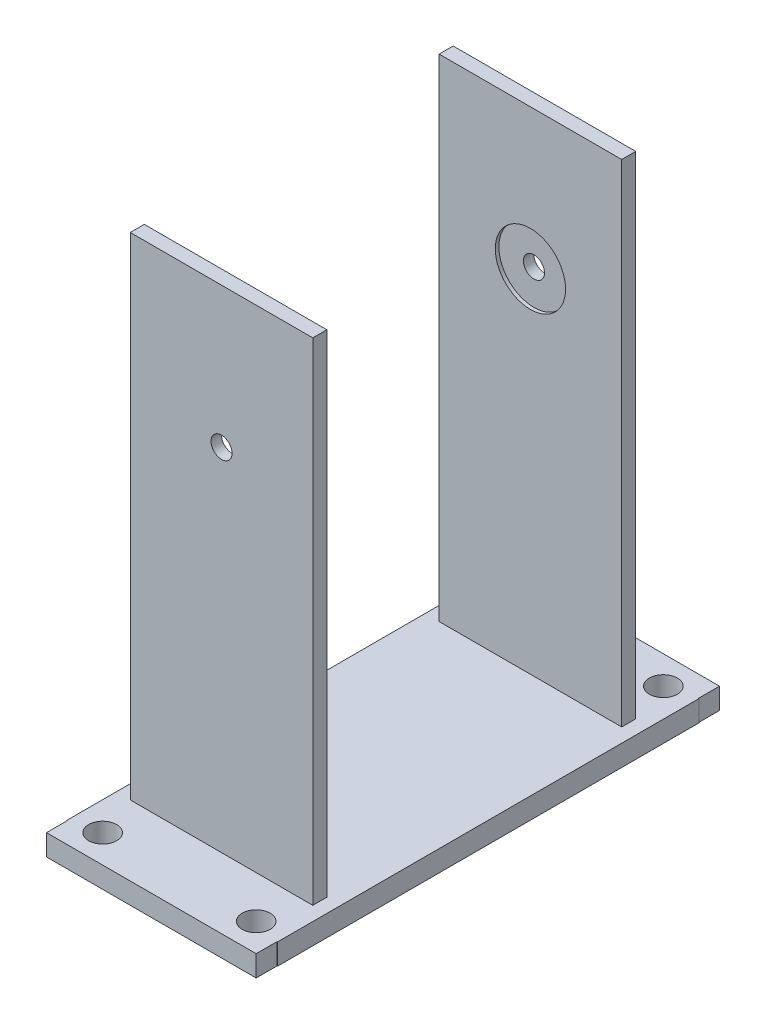
ISO-10303-21;
HEADER;
FILE_DESCRIPTION(('STEP AP214'),'2;1');
FILE_NAME('part.step','',(''),(''),'','','');
FILE_SCHEMA(('AUTOMOTIVE_DESIGN { 1 0 10303 214 1 1 1 1 }'));
ENDSEC;
DATA;
#1=APPLICATION_CONTEXT('core data for automotive mechanical design processes');
#2=APPLICATION_PROTOCOL_DEFINITION('international standard','automotive_design',2000,#1);
#3=PRODUCT_CONTEXT('',#1,'mechanical');
#4=PRODUCT('Part','Part','',(#3));
#5=PRODUCT_RELATED_PRODUCT_CATEGORY('part','',(#4));
#6=PRODUCT_DEFINITION_FORMATION('','',#4);
#7=PRODUCT_DEFINITION_CONTEXT('part definition',#1,'design');
#8=PRODUCT_DEFINITION('design','',#6,#7);
#9=PRODUCT_DEFINITION_SHAPE('','',#8);
#10=(LENGTH_UNIT() NAMED_UNIT(*) SI_UNIT(.MILLI.,.METRE.));
#11=(NAMED_UNIT(*) PLANE_ANGLE_UNIT() SI_UNIT($,.RADIAN.));
#12=(NAMED_UNIT(*) SI_UNIT($,.STERADIAN.) SOLID_ANGLE_UNIT());
#13=UNCERTAINTY_MEASURE_WITH_UNIT(LENGTH_MEASURE(1.E-05),#10,'distance_accuracy_value','');
#14=(GEOMETRIC_REPRESENTATION_CONTEXT(3) GLOBAL_UNCERTAINTY_ASSIGNED_CONTEXT((#13)) GLOBAL_UNIT_ASSIGNED_CONTEXT((#10,
#11,#12)) REPRESENTATION_CONTEXT('',''));
#15=CARTESIAN_POINT('',(0.,0.,0.));
#16=DIRECTION('',(0.,0.,1.));
#17=DIRECTION('',(1.,0.,0.));
#18=AXIS2_PLACEMENT_3D('',#15,#16,#17);
#19=CARTESIAN_POINT('',(0.,3.,0.));
#20=DIRECTION('',(0.,-1.,0.));
#21=DIRECTION('',(0.,0.,-1.));
#22=AXIS2_PLACEMENT_3D('',#19,#20,#21);
#23=PLANE('',#22);
#24=CARTESIAN_POINT('',(10.9297736953923,3.,-29.));
#25=DIRECTION('',(0.,-1.,0.));
#26=DIRECTION('',(0.,0.,-1.));
#27=AXIS2_PLACEMENT_3D('',#24,#25,#26);
#28=CIRCLE('',#27,2.);
#29=CARTESIAN_POINT('',(10.9297736953923,3.,-31.));
#30=VERTEX_POINT('',#29);
#31=EDGE_CURVE('E273',#30,#30,#28,.T.);
#32=ORIENTED_EDGE('',*,*,#31,.T.);
#33=EDGE_LOOP('',(#32));
#34=FACE_BOUND('',#33,.T.);
#35=CARTESIAN_POINT('',(-10.9297736953925,3.,29.));
#36=DIRECTION('',(0.,-1.,0.));
#37=DIRECTION('',(0.,0.,-1.));
#38=AXIS2_PLACEMENT_3D('',#35,#36,#37);
#39=CIRCLE('',#38,2.);
#40=CARTESIAN_POINT('',(-10.9297736953925,3.,27.));
#41=VERTEX_POINT('',#40);
#42=EDGE_CURVE('E269',#41,#41,#39,.T.);
#43=ORIENTED_EDGE('',*,*,#42,.T.);
#44=EDGE_LOOP('',(#43));
#45=FACE_BOUND('',#44,.T.);
#46=DIRECTION('',(1.,0.,0.));
#47=VECTOR('',#46,1.);
#48=CARTESIAN_POINT('',(0.,3.,-23.));
#49=LINE('',#48,#47);
#50=CARTESIAN_POINT('',(-13.,3.,-23.));
#51=VERTEX_POINT('',#50);
#52=CARTESIAN_POINT('',(13.,3.,-23.));
#53=VERTEX_POINT('',#52);
#54=EDGE_CURVE('E388',#51,#53,#49,.T.);
#55=ORIENTED_EDGE('',*,*,#54,.T.);
#56=DIRECTION('',(0.,0.,1.));
#57=VECTOR('',#56,1.);
#58=CARTESIAN_POINT('',(13.,3.,0.));
#59=LINE('',#58,#57);
#60=CARTESIAN_POINT('',(13.,3.,-21.));
#61=VERTEX_POINT('',#60);
#62=EDGE_CURVE('E385',#53,#61,#59,.T.);
#63=ORIENTED_EDGE('',*,*,#62,.T.);
#64=DIRECTION('',(1.,0.,0.));
#65=VECTOR('',#64,1.);
#66=CARTESIAN_POINT('',(0.,3.,-21.));
#67=LINE('',#66,#65);
#68=CARTESIAN_POINT('',(-13.,3.,-21.));
#69=VERTEX_POINT('',#68);
#70=EDGE_CURVE('E374',#69,#61,#67,.T.);
#71=ORIENTED_EDGE('',*,*,#70,.F.);
#72=DIRECTION('',(0.,0.,1.));
#73=VECTOR('',#72,1.);
#74=CARTESIAN_POINT('',(-13.,3.,0.));
#75=LINE('',#74,#73);
#76=EDGE_CURVE('E392',#51,#69,#75,.T.);
#77=ORIENTED_EDGE('',*,*,#76,.F.);
#78=EDGE_LOOP('',(#55,#63,#71,#77));
#79=FACE_BOUND('',#78,.T.);
#80=DIRECTION('',(1.,0.,0.));
#81=VECTOR('',#80,1.);
#82=CARTESIAN_POINT('',(0.,3.,23.));
#83=LINE('',#82,#81);
#84=CARTESIAN_POINT('',(-13.,3.,23.));
#85=VERTEX_POINT('',#84);
#86=CARTESIAN_POINT('',(13.,3.,23.));
#87=VERTEX_POINT('',#86);
#88=EDGE_CURVE('E432',#85,#87,#83,.T.);
#89=ORIENTED_EDGE('',*,*,#88,.F.);
#90=DIRECTION('',(0.,0.,-1.));
#91=VECTOR('',#90,1.);
#92=CARTESIAN_POINT('',(-13.,3.,0.));
#93=LINE('',#92,#91);
#94=CARTESIAN_POINT('',(-13.,3.,21.));
#95=VERTEX_POINT('',#94);
#96=EDGE_CURVE('E368',#85,#95,#93,.T.);
#97=ORIENTED_EDGE('',*,*,#96,.T.);
#98=DIRECTION('',(1.,0.,0.));
#99=VECTOR('',#98,1.);
#100=CARTESIAN_POINT('',(0.,3.,21.));
#101=LINE('',#100,#99);
#102=CARTESIAN_POINT('',(13.,3.,21.));
#103=VERTEX_POINT('',#102);
#104=EDGE_CURVE('E418',#95,#103,#101,.T.);
#105=ORIENTED_EDGE('',*,*,#104,.T.);
#106=DIRECTION('',(0.,0.,-1.));
#107=VECTOR('',#106,1.);
#108=CARTESIAN_POINT('',(13.,3.,0.));
#109=LINE('',#108,#107);
#110=EDGE_CURVE('E435',#87,#103,#109,.T.);
#111=ORIENTED_EDGE('',*,*,#110,.F.);
#112=EDGE_LOOP('',(#89,#97,#105,#111));
#113=FACE_BOUND('',#112,.T.);
#114=DIRECTION('',(0.,0.,-1.));
#115=VECTOR('',#114,1.);
#116=CARTESIAN_POINT('',(15.,3.,30.));
#117=LINE('',#116,#115);
#118=CARTESIAN_POINT('',(15.,3.,30.));
#119=VERTEX_POINT('',#118);
#120=CARTESIAN_POINT('',(15.,3.,-30.));
#121=VERTEX_POINT('',#120);
#122=EDGE_CURVE('E243',#119,#121,#117,.T.);
#123=ORIENTED_EDGE('',*,*,#122,.T.);
#124=DIRECTION('',(-1.,0.,0.));
#125=VECTOR('',#124,1.);
#126=CARTESIAN_POINT('',(-15.,3.,-30.));
#127=LINE('',#126,#125);
#128=CARTESIAN_POINT('',(14.9297736953925,3.,-30.));
#129=VERTEX_POINT('',#128);
#130=EDGE_CURVE('E221',#121,#129,#127,.T.);
#131=ORIENTED_EDGE('',*,*,#130,.T.);
#132=DIRECTION('',(0.,0.,1.));
#133=VECTOR('',#132,1.);
#134=CARTESIAN_POINT('',(14.9297736953925,3.,0.));
#135=LINE('',#134,#133);
#136=CARTESIAN_POINT('',(14.9297736953925,3.,-33.));
#137=VERTEX_POINT('',#136);
#138=EDGE_CURVE('E321',#137,#129,#135,.T.);
#139=ORIENTED_EDGE('',*,*,#138,.F.);
#140=DIRECTION('',(1.,0.,0.));
#141=VECTOR('',#140,1.);
#142=CARTESIAN_POINT('',(0.,3.,-33.));
#143=LINE('',#142,#141);
#144=CARTESIAN_POINT('',(-14.9297736953925,3.,-33.));
#145=VERTEX_POINT('',#144);
#146=EDGE_CURVE('E317',#145,#137,#143,.T.);
#147=ORIENTED_EDGE('',*,*,#146,.F.);
#148=DIRECTION('',(0.,0.,1.));
#149=VECTOR('',#148,1.);
#150=CARTESIAN_POINT('',(-14.9297736953925,3.,0.));
#151=LINE('',#150,#149);
#152=CARTESIAN_POINT('',(-14.9297736953925,3.,-30.));
#153=VERTEX_POINT('',#152);
#154=EDGE_CURVE('E324',#145,#153,#151,.T.);
#155=ORIENTED_EDGE('',*,*,#154,.T.);
#156=CARTESIAN_POINT('',(-15.,3.,-30.));
#157=VERTEX_POINT('',#156);
#158=EDGE_CURVE('E454',#153,#157,#127,.T.);
#159=ORIENTED_EDGE('',*,*,#158,.T.);
#160=DIRECTION('',(0.,0.,1.));
#161=VECTOR('',#160,1.);
#162=CARTESIAN_POINT('',(-15.,3.,30.));
#163=LINE('',#162,#161);
#164=CARTESIAN_POINT('',(-15.,3.,30.));
#165=VERTEX_POINT('',#164);
#166=EDGE_CURVE('E216',#157,#165,#163,.T.);
#167=ORIENTED_EDGE('',*,*,#166,.T.);
#168=DIRECTION('',(1.,0.,0.));
#169=VECTOR('',#168,1.);
#170=CARTESIAN_POINT('',(-15.,3.,30.));
#171=LINE('',#170,#169);
#172=CARTESIAN_POINT('',(-14.9297736953925,3.,30.));
#173=VERTEX_POINT('',#172);
#174=EDGE_CURVE('E215',#165,#173,#171,.T.);
#175=ORIENTED_EDGE('',*,*,#174,.T.);
#176=DIRECTION('',(0.,0.,1.));
#177=VECTOR('',#176,1.);
#178=CARTESIAN_POINT('',(-14.9297736953925,3.,0.));
#179=LINE('',#178,#177);
#180=CARTESIAN_POINT('',(-14.9297736953925,3.,33.));
#181=VERTEX_POINT('',#180);
#182=EDGE_CURVE('E197',#173,#181,#179,.T.);
#183=ORIENTED_EDGE('',*,*,#182,.T.);
#184=DIRECTION('',(1.,0.,0.));
#185=VECTOR('',#184,1.);
#186=CARTESIAN_POINT('',(0.,3.,33.));
#187=LINE('',#186,#185);
#188=CARTESIAN_POINT('',(14.9297736953925,3.,33.));
#189=VERTEX_POINT('',#188);
#190=EDGE_CURVE('E205',#181,#189,#187,.T.);
#191=ORIENTED_EDGE('',*,*,#190,.T.);
#192=DIRECTION('',(0.,0.,1.));
#193=VECTOR('',#192,1.);
#194=CARTESIAN_POINT('',(14.9297736953925,3.,0.));
#195=LINE('',#194,#193);
#196=CARTESIAN_POINT('',(14.9297736953925,3.,30.));
#197=VERTEX_POINT('',#196);
#198=EDGE_CURVE('E191',#197,#189,#195,.T.);
#199=ORIENTED_EDGE('',*,*,#198,.F.);
#200=EDGE_CURVE('E202',#197,#119,#171,.T.);
#201=ORIENTED_EDGE('',*,*,#200,.T.);
#202=EDGE_LOOP('',(#123,#131,#139,#147,#155,#159,#167,#175,#183,#191,#199,#201));
#203=FACE_BOUND('',#202,.T.);
#204=CARTESIAN_POINT('',(-10.9297736953925,3.,-29.));
#205=DIRECTION('',(0.,-1.,0.));
#206=DIRECTION('',(0.,0.,-1.));
#207=AXIS2_PLACEMENT_3D('',#204,#205,#206);
#208=CIRCLE('',#207,2.);
#209=CARTESIAN_POINT('',(-10.9297736953925,3.,-31.));
#210=VERTEX_POINT('',#209);
#211=EDGE_CURVE('E277',#210,#210,#208,.F.);
#212=ORIENTED_EDGE('',*,*,#211,.F.);
#213=EDGE_LOOP('',(#212));
#214=FACE_BOUND('',#213,.T.);
#215=CARTESIAN_POINT('',(10.9297736953923,3.,29.));
#216=DIRECTION('',(0.,-1.,0.));
#217=DIRECTION('',(0.,0.,-1.));
#218=AXIS2_PLACEMENT_3D('',#215,#216,#217);
#219=CIRCLE('',#218,2.);
#220=CARTESIAN_POINT('',(10.9297736953923,3.,27.));
#221=VERTEX_POINT('',#220);
#222=EDGE_CURVE('E290',#221,#221,#219,.F.);
#223=ORIENTED_EDGE('',*,*,#222,.F.);
#224=EDGE_LOOP('',(#223));
#225=FACE_BOUND('',#224,.T.);
#226=ADVANCED_FACE('F49',(#34,#45,#79,#113,#203,#214,#225),#23,.F.);
#227=CARTESIAN_POINT('',(0.,0.,0.));
#228=DIRECTION('',(0.,-1.,0.));
#229=DIRECTION('',(0.,0.,-1.));
#230=AXIS2_PLACEMENT_3D('',#227,#228,#229);
#231=PLANE('',#230);
#232=CARTESIAN_POINT('',(-10.9297736953925,0.,-29.));
#233=DIRECTION('',(0.,-1.,0.));
#234=DIRECTION('',(0.,0.,-1.));
#235=AXIS2_PLACEMENT_3D('',#232,#233,#234);
#236=CIRCLE('',#235,2.);
#237=CARTESIAN_POINT('',(-10.9297736953925,0.,-31.));
#238=VERTEX_POINT('',#237);
#239=EDGE_CURVE('E274',#238,#238,#236,.F.);
#240=ORIENTED_EDGE('',*,*,#239,.T.);
#241=EDGE_LOOP('',(#240));
#242=FACE_BOUND('',#241,.T.);
#243=CARTESIAN_POINT('',(10.9297736953923,0.,-29.));
#244=DIRECTION('',(0.,-1.,0.));
#245=DIRECTION('',(0.,0.,-1.));
#246=AXIS2_PLACEMENT_3D('',#243,#244,#245);
#247=CIRCLE('',#246,2.);
#248=CARTESIAN_POINT('',(10.9297736953923,0.,-31.));
#249=VERTEX_POINT('',#248);
#250=EDGE_CURVE('E270',#249,#249,#247,.T.);
#251=ORIENTED_EDGE('',*,*,#250,.F.);
#252=EDGE_LOOP('',(#251));
#253=FACE_BOUND('',#252,.T.);
#254=CARTESIAN_POINT('',(-10.9297736953925,0.,29.));
#255=DIRECTION('',(0.,-1.,0.));
#256=DIRECTION('',(0.,0.,-1.));
#257=AXIS2_PLACEMENT_3D('',#254,#255,#256);
#258=CIRCLE('',#257,2.);
#259=CARTESIAN_POINT('',(-10.9297736953925,0.,27.));
#260=VERTEX_POINT('',#259);
#261=EDGE_CURVE('E265',#260,#260,#258,.T.);
#262=ORIENTED_EDGE('',*,*,#261,.F.);
#263=EDGE_LOOP('',(#262));
#264=FACE_BOUND('',#263,.T.);
#265=DIRECTION('',(0.,0.,-1.));
#266=VECTOR('',#265,1.);
#267=CARTESIAN_POINT('',(15.,0.,30.));
#268=LINE('',#267,#266);
#269=CARTESIAN_POINT('',(15.,0.,30.));
#270=VERTEX_POINT('',#269);
#271=CARTESIAN_POINT('',(15.,0.,-30.));
#272=VERTEX_POINT('',#271);
#273=EDGE_CURVE('E225',#270,#272,#268,.T.);
#274=ORIENTED_EDGE('',*,*,#273,.F.);
#275=DIRECTION('',(1.,0.,0.));
#276=VECTOR('',#275,1.);
#277=CARTESIAN_POINT('',(-15.,0.,30.));
#278=LINE('',#277,#276);
#279=CARTESIAN_POINT('',(14.9297736953925,0.,30.));
#280=VERTEX_POINT('',#279);
#281=EDGE_CURVE('E238',#280,#270,#278,.T.);
#282=ORIENTED_EDGE('',*,*,#281,.F.);
#283=DIRECTION('',(0.,0.,1.));
#284=VECTOR('',#283,1.);
#285=CARTESIAN_POINT('',(14.9297736953925,0.,0.));
#286=LINE('',#285,#284);
#287=CARTESIAN_POINT('',(14.9297736953925,0.,33.));
#288=VERTEX_POINT('',#287);
#289=EDGE_CURVE('E75',#280,#288,#286,.T.);
#290=ORIENTED_EDGE('',*,*,#289,.T.);
#291=DIRECTION('',(1.,0.,0.));
#292=VECTOR('',#291,1.);
#293=CARTESIAN_POINT('',(0.,0.,33.));
#294=LINE('',#293,#292);
#295=CARTESIAN_POINT('',(-14.9297736953925,0.,33.));
#296=VERTEX_POINT('',#295);
#297=EDGE_CURVE('E301',#296,#288,#294,.T.);
#298=ORIENTED_EDGE('',*,*,#297,.F.);
#299=DIRECTION('',(0.,0.,1.));
#300=VECTOR('',#299,1.);
#301=CARTESIAN_POINT('',(-14.9297736953925,0.,0.));
#302=LINE('',#301,#300);
#303=CARTESIAN_POINT('',(-14.9297736953925,0.,30.));
#304=VERTEX_POINT('',#303);
#305=EDGE_CURVE('E208',#304,#296,#302,.T.);
#306=ORIENTED_EDGE('',*,*,#305,.F.);
#307=CARTESIAN_POINT('',(-15.,0.,30.));
#308=VERTEX_POINT('',#307);
#309=EDGE_CURVE('E239',#308,#304,#278,.T.);
#310=ORIENTED_EDGE('',*,*,#309,.F.);
#311=DIRECTION('',(0.,0.,1.));
#312=VECTOR('',#311,1.);
#313=CARTESIAN_POINT('',(-15.,0.,30.));
#314=LINE('',#313,#312);
#315=CARTESIAN_POINT('',(-15.,0.,-30.));
#316=VERTEX_POINT('',#315);
#317=EDGE_CURVE('E235',#316,#308,#314,.T.);
#318=ORIENTED_EDGE('',*,*,#317,.F.);
#319=DIRECTION('',(-1.,0.,0.));
#320=VECTOR('',#319,1.);
#321=CARTESIAN_POINT('',(-15.,0.,-30.));
#322=LINE('',#321,#320);
#323=CARTESIAN_POINT('',(-14.9297736953925,0.,-30.));
#324=VERTEX_POINT('',#323);
#325=EDGE_CURVE('E229',#324,#316,#322,.T.);
#326=ORIENTED_EDGE('',*,*,#325,.F.);
#327=DIRECTION('',(0.,0.,1.));
#328=VECTOR('',#327,1.);
#329=CARTESIAN_POINT('',(-14.9297736953925,0.,0.));
#330=LINE('',#329,#328);
#331=CARTESIAN_POINT('',(-14.9297736953925,0.,-33.));
#332=VERTEX_POINT('',#331);
#333=EDGE_CURVE('E67',#332,#324,#330,.T.);
#334=ORIENTED_EDGE('',*,*,#333,.F.);
#335=DIRECTION('',(1.,0.,0.));
#336=VECTOR('',#335,1.);
#337=CARTESIAN_POINT('',(0.,0.,-33.));
#338=LINE('',#337,#336);
#339=CARTESIAN_POINT('',(14.9297736953925,0.,-33.));
#340=VERTEX_POINT('',#339);
#341=EDGE_CURVE('E293',#332,#340,#338,.T.);
#342=ORIENTED_EDGE('',*,*,#341,.T.);
#343=DIRECTION('',(0.,0.,1.));
#344=VECTOR('',#343,1.);
#345=CARTESIAN_POINT('',(14.9297736953925,0.,0.));
#346=LINE('',#345,#344);
#347=CARTESIAN_POINT('',(14.9297736953925,0.,-30.));
#348=VERTEX_POINT('',#347);
#349=EDGE_CURVE('E331',#340,#348,#346,.T.);
#350=ORIENTED_EDGE('',*,*,#349,.T.);
#351=EDGE_CURVE('E231',#272,#348,#322,.T.);
#352=ORIENTED_EDGE('',*,*,#351,.F.);
#353=EDGE_LOOP('',(#274,#282,#290,#298,#306,#310,#318,#326,#334,#342,#350,#352));
#354=FACE_BOUND('',#353,.T.);
#355=CARTESIAN_POINT('',(10.9297736953923,0.,29.));
#356=DIRECTION('',(0.,-1.,0.));
#357=DIRECTION('',(0.,0.,-1.));
#358=AXIS2_PLACEMENT_3D('',#355,#356,#357);
#359=CIRCLE('',#358,2.);
#360=CARTESIAN_POINT('',(10.9297736953923,0.,27.));
#361=VERTEX_POINT('',#360);
#362=EDGE_CURVE('E53',#361,#361,#359,.F.);
#363=ORIENTED_EDGE('',*,*,#362,.T.);
#364=EDGE_LOOP('',(#363));
#365=FACE_BOUND('',#364,.T.);
#366=ADVANCED_FACE('F484',(#242,#253,#264,#354,#365),#231,.T.);
#367=CARTESIAN_POINT('',(-15.,3.,-30.));
#368=DIRECTION('',(0.,0.,1.));
#369=DIRECTION('',(1.,0.,0.));
#370=AXIS2_PLACEMENT_3D('',#367,#368,#369);
#371=PLANE('',#370);
#372=DIRECTION('',(0.,-1.,0.));
#373=VECTOR('',#372,1.);
#374=CARTESIAN_POINT('',(14.9297736953925,3.,-30.));
#375=LINE('',#374,#373);
#376=EDGE_CURVE('E342',#129,#348,#375,.T.);
#377=ORIENTED_EDGE('',*,*,#376,.F.);
#378=ORIENTED_EDGE('',*,*,#130,.F.);
#379=DIRECTION('',(0.,-1.,0.));
#380=VECTOR('',#379,1.);
#381=CARTESIAN_POINT('',(15.,3.,-30.));
#382=LINE('',#381,#380);
#383=EDGE_CURVE('E11',#121,#272,#382,.T.);
#384=ORIENTED_EDGE('',*,*,#383,.T.);
#385=ORIENTED_EDGE('',*,*,#351,.T.);
#386=EDGE_LOOP('',(#377,#378,#384,#385));
#387=FACE_BOUND('',#386,.T.);
#388=ADVANCED_FACE('F505',(#387),#371,.F.);
#389=CARTESIAN_POINT('',(-15.,3.,30.));
#390=DIRECTION('',(0.,0.,-1.));
#391=DIRECTION('',(-1.,0.,0.));
#392=AXIS2_PLACEMENT_3D('',#389,#390,#391);
#393=PLANE('',#392);
#394=DIRECTION('',(0.,-1.,0.));
#395=VECTOR('',#394,1.);
#396=CARTESIAN_POINT('',(-14.9297736953925,3.,30.));
#397=LINE('',#396,#395);
#398=EDGE_CURVE('E264',#173,#304,#397,.T.);
#399=ORIENTED_EDGE('',*,*,#398,.F.);
#400=ORIENTED_EDGE('',*,*,#174,.F.);
#401=DIRECTION('',(0.,-1.,0.));
#402=VECTOR('',#401,1.);
#403=CARTESIAN_POINT('',(-15.,3.,30.));
#404=LINE('',#403,#402);
#405=EDGE_CURVE('E246',#165,#308,#404,.T.);
#406=ORIENTED_EDGE('',*,*,#405,.T.);
#407=ORIENTED_EDGE('',*,*,#309,.T.);
#408=EDGE_LOOP('',(#399,#400,#406,#407));
#409=FACE_BOUND('',#408,.T.);
#410=ADVANCED_FACE('F475',(#409),#393,.F.);
#411=CARTESIAN_POINT('',(15.,3.,30.));
#412=DIRECTION('',(-1.,0.,0.));
#413=DIRECTION('',(0.,0.,1.));
#414=AXIS2_PLACEMENT_3D('',#411,#412,#413);
#415=PLANE('',#414);
#416=ORIENTED_EDGE('',*,*,#273,.T.);
#417=ORIENTED_EDGE('',*,*,#383,.F.);
#418=ORIENTED_EDGE('',*,*,#122,.F.);
#419=DIRECTION('',(0.,-1.,0.));
#420=VECTOR('',#419,1.);
#421=CARTESIAN_POINT('',(15.,3.,30.));
#422=LINE('',#421,#420);
#423=EDGE_CURVE('E212',#119,#270,#422,.T.);
#424=ORIENTED_EDGE('',*,*,#423,.T.);
#425=EDGE_LOOP('',(#416,#417,#418,#424));
#426=FACE_BOUND('',#425,.T.);
#427=ADVANCED_FACE('F51',(#426),#415,.F.);
#428=ORIENTED_EDGE('',*,*,#158,.F.);
#429=DIRECTION('',(0.,-1.,0.));
#430=VECTOR('',#429,1.);
#431=CARTESIAN_POINT('',(-14.9297736953925,3.,-30.));
#432=LINE('',#431,#430);
#433=EDGE_CURVE('E339',#153,#324,#432,.T.);
#434=ORIENTED_EDGE('',*,*,#433,.T.);
#435=ORIENTED_EDGE('',*,*,#325,.T.);
#436=DIRECTION('',(0.,-1.,0.));
#437=VECTOR('',#436,1.);
#438=CARTESIAN_POINT('',(-15.,3.,-30.));
#439=LINE('',#438,#437);
#440=EDGE_CURVE('E59',#157,#316,#439,.T.);
#441=ORIENTED_EDGE('',*,*,#440,.F.);
#442=EDGE_LOOP('',(#428,#434,#435,#441));
#443=FACE_BOUND('',#442,.T.);
#444=ADVANCED_FACE('F466',(#443),#371,.F.);
#445=CARTESIAN_POINT('',(-15.,3.,30.));
#446=DIRECTION('',(1.,0.,0.));
#447=DIRECTION('',(0.,0.,-1.));
#448=AXIS2_PLACEMENT_3D('',#445,#446,#447);
#449=PLANE('',#448);
#450=ORIENTED_EDGE('',*,*,#317,.T.);
#451=ORIENTED_EDGE('',*,*,#405,.F.);
#452=ORIENTED_EDGE('',*,*,#166,.F.);
#453=ORIENTED_EDGE('',*,*,#440,.T.);
#454=EDGE_LOOP('',(#450,#451,#452,#453));
#455=FACE_BOUND('',#454,.T.);
#456=ADVANCED_FACE('F470',(#455),#449,.F.);
#457=ORIENTED_EDGE('',*,*,#200,.F.);
#458=DIRECTION('',(0.,-1.,0.));
#459=VECTOR('',#458,1.);
#460=CARTESIAN_POINT('',(14.9297736953925,3.,30.));
#461=LINE('',#460,#459);
#462=EDGE_CURVE('E188',#197,#280,#461,.T.);
#463=ORIENTED_EDGE('',*,*,#462,.T.);
#464=ORIENTED_EDGE('',*,*,#281,.T.);
#465=ORIENTED_EDGE('',*,*,#423,.F.);
#466=EDGE_LOOP('',(#457,#463,#464,#465));
#467=FACE_BOUND('',#466,.T.);
#468=ADVANCED_FACE('F210',(#467),#393,.F.);
#469=CARTESIAN_POINT('',(-13.,73.,0.));
#470=DIRECTION('',(-1.,0.,0.));
#471=DIRECTION('',(0.,0.,1.));
#472=AXIS2_PLACEMENT_3D('',#469,#470,#471);
#473=PLANE('',#472);
#474=ORIENTED_EDGE('',*,*,#96,.F.);
#475=DIRECTION('',(0.,-1.,0.));
#476=VECTOR('',#475,1.);
#477=CARTESIAN_POINT('',(-13.,73.,23.));
#478=LINE('',#477,#476);
#479=CARTESIAN_POINT('',(-13.,73.,23.));
#480=VERTEX_POINT('',#479);
#481=EDGE_CURVE('E389',#480,#85,#478,.T.);
#482=ORIENTED_EDGE('',*,*,#481,.F.);
#483=DIRECTION('',(0.,0.,-1.));
#484=VECTOR('',#483,1.);
#485=CARTESIAN_POINT('',(-13.,73.,0.));
#486=LINE('',#485,#484);
#487=CARTESIAN_POINT('',(-13.,73.,21.));
#488=VERTEX_POINT('',#487);
#489=EDGE_CURVE('E413',#480,#488,#486,.T.);
#490=ORIENTED_EDGE('',*,*,#489,.T.);
#491=DIRECTION('',(0.,-1.,0.));
#492=VECTOR('',#491,1.);
#493=CARTESIAN_POINT('',(-13.,73.,21.));
#494=LINE('',#493,#492);
#495=EDGE_CURVE('E428',#488,#95,#494,.T.);
#496=ORIENTED_EDGE('',*,*,#495,.T.);
#497=EDGE_LOOP('',(#474,#482,#490,#496));
#498=FACE_BOUND('',#497,.T.);
#499=ADVANCED_FACE('F509',(#498),#473,.T.);
#500=CARTESIAN_POINT('',(0.,73.,23.));
#501=DIRECTION('',(0.,0.,-1.));
#502=DIRECTION('',(-1.,0.,0.));
#503=AXIS2_PLACEMENT_3D('',#500,#501,#502);
#504=PLANE('',#503);
#505=CARTESIAN_POINT('',(0.,53.,23.));
#506=DIRECTION('',(0.,0.,-1.));
#507=DIRECTION('',(-1.,0.,0.));
#508=AXIS2_PLACEMENT_3D('',#505,#506,#507);
#509=CIRCLE('',#508,1.5);
#510=CARTESIAN_POINT('',(-1.49999999999999,53.,23.));
#511=VERTEX_POINT('',#510);
#512=EDGE_CURVE('E354',#511,#511,#509,.T.);
#513=ORIENTED_EDGE('',*,*,#512,.T.);
#514=EDGE_LOOP('',(#513));
#515=FACE_BOUND('',#514,.T.);
#516=ORIENTED_EDGE('',*,*,#88,.T.);
#517=DIRECTION('',(0.,-1.,0.));
#518=VECTOR('',#517,1.);
#519=CARTESIAN_POINT('',(13.,73.,23.));
#520=LINE('',#519,#518);
#521=CARTESIAN_POINT('',(13.,73.,23.));
#522=VERTEX_POINT('',#521);
#523=EDGE_CURVE('E447',#522,#87,#520,.T.);
#524=ORIENTED_EDGE('',*,*,#523,.F.);
#525=DIRECTION('',(1.,0.,0.));
#526=VECTOR('',#525,1.);
#527=CARTESIAN_POINT('',(0.,73.,23.));
#528=LINE('',#527,#526);
#529=EDGE_CURVE('E417',#480,#522,#528,.T.);
#530=ORIENTED_EDGE('',*,*,#529,.F.);
#531=ORIENTED_EDGE('',*,*,#481,.T.);
#532=EDGE_LOOP('',(#516,#524,#530,#531));
#533=FACE_BOUND('',#532,.T.);
#534=ADVANCED_FACE('F592',(#515,#533),#504,.F.);
#535=CARTESIAN_POINT('',(13.,73.,0.));
#536=DIRECTION('',(-1.,0.,0.));
#537=DIRECTION('',(0.,0.,1.));
#538=AXIS2_PLACEMENT_3D('',#535,#536,#537);
#539=PLANE('',#538);
#540=ORIENTED_EDGE('',*,*,#110,.T.);
#541=DIRECTION('',(0.,-1.,0.));
#542=VECTOR('',#541,1.);
#543=CARTESIAN_POINT('',(13.,73.,21.));
#544=LINE('',#543,#542);
#545=CARTESIAN_POINT('',(13.,73.,21.));
#546=VERTEX_POINT('',#545);
#547=EDGE_CURVE('E443',#546,#103,#544,.T.);
#548=ORIENTED_EDGE('',*,*,#547,.F.);
#549=DIRECTION('',(0.,0.,-1.));
#550=VECTOR('',#549,1.);
#551=CARTESIAN_POINT('',(13.,73.,0.));
#552=LINE('',#551,#550);
#553=EDGE_CURVE('E421',#522,#546,#552,.T.);
#554=ORIENTED_EDGE('',*,*,#553,.F.);
#555=ORIENTED_EDGE('',*,*,#523,.T.);
#556=EDGE_LOOP('',(#540,#548,#554,#555));
#557=FACE_BOUND('',#556,.T.);
#558=ADVANCED_FACE('F589',(#557),#539,.F.);
#559=CARTESIAN_POINT('',(0.,73.,21.));
#560=DIRECTION('',(0.,0.,-1.));
#561=DIRECTION('',(-1.,0.,0.));
#562=AXIS2_PLACEMENT_3D('',#559,#560,#561);
#563=PLANE('',#562);
#564=CARTESIAN_POINT('',(0.,53.,21.));
#565=DIRECTION('',(0.,0.,-1.));
#566=DIRECTION('',(-1.,0.,0.));
#567=AXIS2_PLACEMENT_3D('',#564,#565,#566);
#568=CIRCLE('',#567,5.);
#569=CARTESIAN_POINT('',(-4.99999999999999,53.,21.));
#570=VERTEX_POINT('',#569);
#571=EDGE_CURVE('E257',#570,#570,#568,.T.);
#572=ORIENTED_EDGE('',*,*,#571,.F.);
#573=EDGE_LOOP('',(#572));
#574=FACE_BOUND('',#573,.T.);
#575=ORIENTED_EDGE('',*,*,#104,.F.);
#576=ORIENTED_EDGE('',*,*,#495,.F.);
#577=DIRECTION('',(1.,0.,0.));
#578=VECTOR('',#577,1.);
#579=CARTESIAN_POINT('',(0.,73.,21.));
#580=LINE('',#579,#578);
#581=EDGE_CURVE('E424',#488,#546,#580,.T.);
#582=ORIENTED_EDGE('',*,*,#581,.T.);
#583=ORIENTED_EDGE('',*,*,#547,.T.);
#584=EDGE_LOOP('',(#575,#576,#582,#583));
#585=FACE_BOUND('',#584,.T.);
#586=ADVANCED_FACE('F585',(#574,#585),#563,.T.);
#587=CARTESIAN_POINT('',(0.,73.,0.));
#588=DIRECTION('',(0.,1.,0.));
#589=DIRECTION('',(0.,0.,1.));
#590=AXIS2_PLACEMENT_3D('',#587,#588,#589);
#591=PLANE('',#590);
#592=ORIENTED_EDGE('',*,*,#489,.F.);
#593=ORIENTED_EDGE('',*,*,#529,.T.);
#594=ORIENTED_EDGE('',*,*,#553,.T.);
#595=ORIENTED_EDGE('',*,*,#581,.F.);
#596=EDGE_LOOP('',(#592,#593,#594,#595));
#597=FACE_BOUND('',#596,.T.);
#598=ADVANCED_FACE('F581',(#597),#591,.T.);
#599=CARTESIAN_POINT('',(13.,73.,0.));
#600=DIRECTION('',(1.,0.,0.));
#601=DIRECTION('',(0.,0.,-1.));
#602=AXIS2_PLACEMENT_3D('',#599,#600,#601);
#603=PLANE('',#602);
#604=ORIENTED_EDGE('',*,*,#62,.F.);
#605=DIRECTION('',(0.,-1.,0.));
#606=VECTOR('',#605,1.);
#607=CARTESIAN_POINT('',(13.,73.,-23.));
#608=LINE('',#607,#606);
#609=CARTESIAN_POINT('',(13.,73.,-23.));
#610=VERTEX_POINT('',#609);
#611=EDGE_CURVE('E230',#610,#53,#608,.T.);
#612=ORIENTED_EDGE('',*,*,#611,.F.);
#613=DIRECTION('',(0.,0.,1.));
#614=VECTOR('',#613,1.);
#615=CARTESIAN_POINT('',(13.,73.,0.));
#616=LINE('',#615,#614);
#617=CARTESIAN_POINT('',(13.,73.,-21.));
#618=VERTEX_POINT('',#617);
#619=EDGE_CURVE('E369',#610,#618,#616,.T.);
#620=ORIENTED_EDGE('',*,*,#619,.T.);
#621=DIRECTION('',(0.,-1.,0.));
#622=VECTOR('',#621,1.);
#623=CARTESIAN_POINT('',(13.,73.,-21.));
#624=LINE('',#623,#622);
#625=EDGE_CURVE('E384',#618,#61,#624,.T.);
#626=ORIENTED_EDGE('',*,*,#625,.T.);
#627=EDGE_LOOP('',(#604,#612,#620,#626));
#628=FACE_BOUND('',#627,.T.);
#629=ADVANCED_FACE('F577',(#628),#603,.T.);
#630=CARTESIAN_POINT('',(0.,73.,-23.));
#631=DIRECTION('',(0.,0.,-1.));
#632=DIRECTION('',(-1.,0.,0.));
#633=AXIS2_PLACEMENT_3D('',#630,#631,#632);
#634=PLANE('',#633);
#635=CARTESIAN_POINT('',(0.,53.,-23.));
#636=DIRECTION('',(0.,0.,-1.));
#637=DIRECTION('',(-1.,0.,0.));
#638=AXIS2_PLACEMENT_3D('',#635,#636,#637);
#639=CIRCLE('',#638,1.5);
#640=CARTESIAN_POINT('',(-1.49999999999999,53.,-23.));
#641=VERTEX_POINT('',#640);
#642=EDGE_CURVE('E350',#641,#641,#639,.T.);
#643=ORIENTED_EDGE('',*,*,#642,.F.);
#644=EDGE_LOOP('',(#643));
#645=FACE_BOUND('',#644,.T.);
#646=ORIENTED_EDGE('',*,*,#54,.F.);
#647=DIRECTION('',(0.,-1.,0.));
#648=VECTOR('',#647,1.);
#649=CARTESIAN_POINT('',(-13.,73.,-23.));
#650=LINE('',#649,#648);
#651=CARTESIAN_POINT('',(-13.,73.,-23.));
#652=VERTEX_POINT('',#651);
#653=EDGE_CURVE('E406',#652,#51,#650,.T.);
#654=ORIENTED_EDGE('',*,*,#653,.F.);
#655=DIRECTION('',(1.,0.,0.));
#656=VECTOR('',#655,1.);
#657=CARTESIAN_POINT('',(0.,73.,-23.));
#658=LINE('',#657,#656);
#659=EDGE_CURVE('E373',#652,#610,#658,.T.);
#660=ORIENTED_EDGE('',*,*,#659,.T.);
#661=ORIENTED_EDGE('',*,*,#611,.T.);
#662=EDGE_LOOP('',(#646,#654,#660,#661));
#663=FACE_BOUND('',#662,.T.);
#664=ADVANCED_FACE('F573',(#645,#663),#634,.T.);
#665=CARTESIAN_POINT('',(-13.,73.,0.));
#666=DIRECTION('',(1.,0.,0.));
#667=DIRECTION('',(0.,0.,-1.));
#668=AXIS2_PLACEMENT_3D('',#665,#666,#667);
#669=PLANE('',#668);
#670=ORIENTED_EDGE('',*,*,#76,.T.);
#671=DIRECTION('',(0.,-1.,0.));
#672=VECTOR('',#671,1.);
#673=CARTESIAN_POINT('',(-13.,73.,-21.));
#674=LINE('',#673,#672);
#675=CARTESIAN_POINT('',(-13.,73.,-21.));
#676=VERTEX_POINT('',#675);
#677=EDGE_CURVE('E402',#676,#69,#674,.T.);
#678=ORIENTED_EDGE('',*,*,#677,.F.);
#679=DIRECTION('',(0.,0.,1.));
#680=VECTOR('',#679,1.);
#681=CARTESIAN_POINT('',(-13.,73.,0.));
#682=LINE('',#681,#680);
#683=EDGE_CURVE('E378',#652,#676,#682,.T.);
#684=ORIENTED_EDGE('',*,*,#683,.F.);
#685=ORIENTED_EDGE('',*,*,#653,.T.);
#686=EDGE_LOOP('',(#670,#678,#684,#685));
#687=FACE_BOUND('',#686,.T.);
#688=ADVANCED_FACE('F569',(#687),#669,.F.);
#689=CARTESIAN_POINT('',(0.,73.,-21.));
#690=DIRECTION('',(0.,0.,-1.));
#691=DIRECTION('',(-1.,0.,0.));
#692=AXIS2_PLACEMENT_3D('',#689,#690,#691);
#693=PLANE('',#692);
#694=CARTESIAN_POINT('',(0.,53.,-21.));
#695=DIRECTION('',(0.,0.,-1.));
#696=DIRECTION('',(-1.,0.,0.));
#697=AXIS2_PLACEMENT_3D('',#694,#695,#696);
#698=CIRCLE('',#697,5.);
#699=CARTESIAN_POINT('',(-4.99999999999999,53.,-21.));
#700=VERTEX_POINT('',#699);
#701=EDGE_CURVE('E253',#700,#700,#698,.T.);
#702=ORIENTED_EDGE('',*,*,#701,.T.);
#703=EDGE_LOOP('',(#702));
#704=FACE_BOUND('',#703,.T.);
#705=ORIENTED_EDGE('',*,*,#70,.T.);
#706=ORIENTED_EDGE('',*,*,#625,.F.);
#707=DIRECTION('',(1.,0.,0.));
#708=VECTOR('',#707,1.);
#709=CARTESIAN_POINT('',(0.,73.,-21.));
#710=LINE('',#709,#708);
#711=EDGE_CURVE('E381',#676,#618,#710,.T.);
#712=ORIENTED_EDGE('',*,*,#711,.F.);
#713=ORIENTED_EDGE('',*,*,#677,.T.);
#714=EDGE_LOOP('',(#705,#706,#712,#713));
#715=FACE_BOUND('',#714,.T.);
#716=ADVANCED_FACE('F565',(#704,#715),#693,.F.);
#717=CARTESIAN_POINT('',(0.,73.,0.));
#718=DIRECTION('',(0.,1.,0.));
#719=DIRECTION('',(0.,0.,1.));
#720=AXIS2_PLACEMENT_3D('',#717,#718,#719);
#721=PLANE('',#720);
#722=ORIENTED_EDGE('',*,*,#619,.F.);
#723=ORIENTED_EDGE('',*,*,#659,.F.);
#724=ORIENTED_EDGE('',*,*,#683,.T.);
#725=ORIENTED_EDGE('',*,*,#711,.T.);
#726=EDGE_LOOP('',(#722,#723,#724,#725));
#727=FACE_BOUND('',#726,.T.);
#728=ADVANCED_FACE('F553',(#727),#721,.T.);
#729=CARTESIAN_POINT('',(0.,0.,-21.5));
#730=DIRECTION('',(0.,0.,1.));
#731=DIRECTION('',(1.,0.,0.));
#732=AXIS2_PLACEMENT_3D('',#729,#730,#731);
#733=PLANE('',#732);
#734=CARTESIAN_POINT('',(0.,53.,-21.5));
#735=DIRECTION('',(0.,0.,1.));
#736=DIRECTION('',(1.,0.,0.));
#737=AXIS2_PLACEMENT_3D('',#734,#735,#736);
#738=CIRCLE('',#737,1.5);
#739=CARTESIAN_POINT('',(1.50000000000001,53.,-21.5));
#740=VERTEX_POINT('',#739);
#741=EDGE_CURVE('E263',#740,#740,#738,.T.);
#742=ORIENTED_EDGE('',*,*,#741,.F.);
#743=EDGE_LOOP('',(#742));
#744=FACE_BOUND('',#743,.T.);
#745=CARTESIAN_POINT('',(0.,53.,-21.5));
#746=DIRECTION('',(0.,0.,1.));
#747=DIRECTION('',(1.,0.,0.));
#748=AXIS2_PLACEMENT_3D('',#745,#746,#747);
#749=CIRCLE('',#748,5.);
#750=CARTESIAN_POINT('',(5.00000000000001,53.,-21.5));
#751=VERTEX_POINT('',#750);
#752=EDGE_CURVE('E258',#751,#751,#749,.T.);
#753=ORIENTED_EDGE('',*,*,#752,.T.);
#754=EDGE_LOOP('',(#753));
#755=FACE_BOUND('',#754,.T.);
#756=ADVANCED_FACE('F549',(#744,#755),#733,.T.);
#757=CARTESIAN_POINT('',(0.,53.,-21.5));
#758=DIRECTION('',(0.,0.,1.));
#759=DIRECTION('',(1.,0.,0.));
#760=AXIS2_PLACEMENT_3D('',#757,#758,#759);
#761=CYLINDRICAL_SURFACE('',#760,5.);
#762=ORIENTED_EDGE('',*,*,#752,.F.);
#763=EDGE_LOOP('',(#762));
#764=FACE_BOUND('',#763,.T.);
#765=ORIENTED_EDGE('',*,*,#701,.F.);
#766=EDGE_LOOP('',(#765));
#767=FACE_BOUND('',#766,.T.);
#768=ADVANCED_FACE('F552',(#764,#767),#761,.F.);
#769=ORIENTED_EDGE('',*,*,#571,.T.);
#770=EDGE_LOOP('',(#769));
#771=FACE_BOUND('',#770,.T.);
#772=CARTESIAN_POINT('',(0.,53.,21.5));
#773=DIRECTION('',(0.,0.,1.));
#774=DIRECTION('',(1.,0.,0.));
#775=AXIS2_PLACEMENT_3D('',#772,#773,#774);
#776=CIRCLE('',#775,5.);
#777=CARTESIAN_POINT('',(5.00000000000001,53.,21.5));
#778=VERTEX_POINT('',#777);
#779=EDGE_CURVE('E358',#778,#778,#776,.T.);
#780=ORIENTED_EDGE('',*,*,#779,.T.);
#781=EDGE_LOOP('',(#780));
#782=FACE_BOUND('',#781,.T.);
#783=ADVANCED_FACE('F558',(#771,#782),#761,.F.);
#784=CARTESIAN_POINT('',(0.,0.,21.5));
#785=DIRECTION('',(0.,0.,1.));
#786=DIRECTION('',(1.,0.,0.));
#787=AXIS2_PLACEMENT_3D('',#784,#785,#786);
#788=PLANE('',#787);
#789=CARTESIAN_POINT('',(0.,53.,21.5));
#790=DIRECTION('',(0.,0.,1.));
#791=DIRECTION('',(1.,0.,0.));
#792=AXIS2_PLACEMENT_3D('',#789,#790,#791);
#793=CIRCLE('',#792,1.5);
#794=CARTESIAN_POINT('',(1.50000000000001,53.,21.5));
#795=VERTEX_POINT('',#794);
#796=EDGE_CURVE('E259',#795,#795,#793,.T.);
#797=ORIENTED_EDGE('',*,*,#796,.T.);
#798=EDGE_LOOP('',(#797));
#799=FACE_BOUND('',#798,.T.);
#800=ORIENTED_EDGE('',*,*,#779,.F.);
#801=EDGE_LOOP('',(#800));
#802=FACE_BOUND('',#801,.T.);
#803=ADVANCED_FACE('F555',(#799,#802),#788,.F.);
#804=CARTESIAN_POINT('',(0.,53.,-30.));
#805=DIRECTION('',(0.,0.,1.));
#806=DIRECTION('',(1.,0.,0.));
#807=AXIS2_PLACEMENT_3D('',#804,#805,#806);
#808=CYLINDRICAL_SURFACE('',#807,1.5);
#809=ORIENTED_EDGE('',*,*,#796,.F.);
#810=EDGE_LOOP('',(#809));
#811=FACE_BOUND('',#810,.T.);
#812=ORIENTED_EDGE('',*,*,#512,.F.);
#813=EDGE_LOOP('',(#812));
#814=FACE_BOUND('',#813,.T.);
#815=ADVANCED_FACE('F547',(#811,#814),#808,.F.);
#816=ORIENTED_EDGE('',*,*,#642,.T.);
#817=EDGE_LOOP('',(#816));
#818=FACE_BOUND('',#817,.T.);
#819=ORIENTED_EDGE('',*,*,#741,.T.);
#820=EDGE_LOOP('',(#819));
#821=FACE_BOUND('',#820,.T.);
#822=ADVANCED_FACE('F545',(#818,#821),#808,.F.);
#823=CARTESIAN_POINT('',(-14.9297736953925,3.,0.));
#824=DIRECTION('',(1.,0.,0.));
#825=DIRECTION('',(0.,0.,-1.));
#826=AXIS2_PLACEMENT_3D('',#823,#824,#825);
#827=PLANE('',#826);
#828=ORIENTED_EDGE('',*,*,#305,.T.);
#829=DIRECTION('',(0.,-1.,0.));
#830=VECTOR('',#829,1.);
#831=CARTESIAN_POINT('',(-14.9297736953925,3.,33.));
#832=LINE('',#831,#830);
#833=EDGE_CURVE('E311',#181,#296,#832,.T.);
#834=ORIENTED_EDGE('',*,*,#833,.F.);
#835=ORIENTED_EDGE('',*,*,#182,.F.);
#836=ORIENTED_EDGE('',*,*,#398,.T.);
#837=EDGE_LOOP('',(#828,#834,#835,#836));
#838=FACE_BOUND('',#837,.T.);
#839=ADVANCED_FACE('F478',(#838),#827,.F.);
#840=CARTESIAN_POINT('',(0.,3.,33.));
#841=DIRECTION('',(0.,0.,-1.));
#842=DIRECTION('',(-1.,0.,0.));
#843=AXIS2_PLACEMENT_3D('',#840,#841,#842);
#844=PLANE('',#843);
#845=ORIENTED_EDGE('',*,*,#297,.T.);
#846=DIRECTION('',(0.,-1.,0.));
#847=VECTOR('',#846,1.);
#848=CARTESIAN_POINT('',(14.9297736953925,3.,33.));
#849=LINE('',#848,#847);
#850=EDGE_CURVE('E196',#189,#288,#849,.T.);
#851=ORIENTED_EDGE('',*,*,#850,.F.);
#852=ORIENTED_EDGE('',*,*,#190,.F.);
#853=ORIENTED_EDGE('',*,*,#833,.T.);
#854=EDGE_LOOP('',(#845,#851,#852,#853));
#855=FACE_BOUND('',#854,.T.);
#856=ADVANCED_FACE('F481',(#855),#844,.F.);
#857=CARTESIAN_POINT('',(14.9297736953925,3.,0.));
#858=DIRECTION('',(1.,0.,0.));
#859=DIRECTION('',(0.,0.,-1.));
#860=AXIS2_PLACEMENT_3D('',#857,#858,#859);
#861=PLANE('',#860);
#862=ORIENTED_EDGE('',*,*,#289,.F.);
#863=ORIENTED_EDGE('',*,*,#462,.F.);
#864=ORIENTED_EDGE('',*,*,#198,.T.);
#865=ORIENTED_EDGE('',*,*,#850,.T.);
#866=EDGE_LOOP('',(#862,#863,#864,#865));
#867=FACE_BOUND('',#866,.T.);
#868=ADVANCED_FACE('F190',(#867),#861,.T.);
#869=CARTESIAN_POINT('',(0.,3.,-33.));
#870=DIRECTION('',(0.,0.,-1.));
#871=DIRECTION('',(-1.,0.,0.));
#872=AXIS2_PLACEMENT_3D('',#869,#870,#871);
#873=PLANE('',#872);
#874=ORIENTED_EDGE('',*,*,#341,.F.);
#875=DIRECTION('',(0.,-1.,0.));
#876=VECTOR('',#875,1.);
#877=CARTESIAN_POINT('',(-14.9297736953925,3.,-33.));
#878=LINE('',#877,#876);
#879=EDGE_CURVE('E302',#145,#332,#878,.T.);
#880=ORIENTED_EDGE('',*,*,#879,.F.);
#881=ORIENTED_EDGE('',*,*,#146,.T.);
#882=DIRECTION('',(0.,-1.,0.));
#883=VECTOR('',#882,1.);
#884=CARTESIAN_POINT('',(14.9297736953925,3.,-33.));
#885=LINE('',#884,#883);
#886=EDGE_CURVE('E327',#137,#340,#885,.T.);
#887=ORIENTED_EDGE('',*,*,#886,.T.);
#888=EDGE_LOOP('',(#874,#880,#881,#887));
#889=FACE_BOUND('',#888,.T.);
#890=ADVANCED_FACE('F532',(#889),#873,.T.);
#891=CARTESIAN_POINT('',(-14.9297736953925,3.,0.));
#892=DIRECTION('',(1.,0.,0.));
#893=DIRECTION('',(0.,0.,-1.));
#894=AXIS2_PLACEMENT_3D('',#891,#892,#893);
#895=PLANE('',#894);
#896=ORIENTED_EDGE('',*,*,#333,.T.);
#897=ORIENTED_EDGE('',*,*,#433,.F.);
#898=ORIENTED_EDGE('',*,*,#154,.F.);
#899=ORIENTED_EDGE('',*,*,#879,.T.);
#900=EDGE_LOOP('',(#896,#897,#898,#899));
#901=FACE_BOUND('',#900,.T.);
#902=ADVANCED_FACE('F533',(#901),#895,.F.);
#903=CARTESIAN_POINT('',(14.9297736953925,3.,0.));
#904=DIRECTION('',(1.,0.,0.));
#905=DIRECTION('',(0.,0.,-1.));
#906=AXIS2_PLACEMENT_3D('',#903,#904,#905);
#907=PLANE('',#906);
#908=ORIENTED_EDGE('',*,*,#349,.F.);
#909=ORIENTED_EDGE('',*,*,#886,.F.);
#910=ORIENTED_EDGE('',*,*,#138,.T.);
#911=ORIENTED_EDGE('',*,*,#376,.T.);
#912=EDGE_LOOP('',(#908,#909,#910,#911));
#913=FACE_BOUND('',#912,.T.);
#914=ADVANCED_FACE('F529',(#913),#907,.T.);
#915=CARTESIAN_POINT('',(-10.9297736953925,73.,29.));
#916=DIRECTION('',(0.,-1.,0.));
#917=DIRECTION('',(0.,0.,-1.));
#918=AXIS2_PLACEMENT_3D('',#915,#916,#917);
#919=CYLINDRICAL_SURFACE('',#918,2.);
#920=ORIENTED_EDGE('',*,*,#261,.T.);
#921=EDGE_LOOP('',(#920));
#922=FACE_BOUND('',#921,.T.);
#923=ORIENTED_EDGE('',*,*,#42,.F.);
#924=EDGE_LOOP('',(#923));
#925=FACE_BOUND('',#924,.T.);
#926=ADVANCED_FACE('F539',(#922,#925),#919,.F.);
#927=CARTESIAN_POINT('',(10.9297736953923,73.,-29.));
#928=DIRECTION('',(0.,-1.,0.));
#929=DIRECTION('',(0.,0.,-1.));
#930=AXIS2_PLACEMENT_3D('',#927,#928,#929);
#931=CYLINDRICAL_SURFACE('',#930,2.);
#932=ORIENTED_EDGE('',*,*,#250,.T.);
#933=EDGE_LOOP('',(#932));
#934=FACE_BOUND('',#933,.T.);
#935=ORIENTED_EDGE('',*,*,#31,.F.);
#936=EDGE_LOOP('',(#935));
#937=FACE_BOUND('',#936,.T.);
#938=ADVANCED_FACE('F710',(#934,#937),#931,.F.);
#939=CARTESIAN_POINT('',(-10.9297736953925,73.,-29.));
#940=DIRECTION('',(0.,-1.,0.));
#941=DIRECTION('',(0.,0.,-1.));
#942=AXIS2_PLACEMENT_3D('',#939,#940,#941);
#943=CYLINDRICAL_SURFACE('',#942,2.);
#944=ORIENTED_EDGE('',*,*,#239,.F.);
#945=EDGE_LOOP('',(#944));
#946=FACE_BOUND('',#945,.T.);
#947=ORIENTED_EDGE('',*,*,#211,.T.);
#948=EDGE_LOOP('',(#947));
#949=FACE_BOUND('',#948,.T.);
#950=ADVANCED_FACE('F495',(#946,#949),#943,.F.);
#951=CARTESIAN_POINT('',(10.9297736953923,73.,29.));
#952=DIRECTION('',(0.,-1.,0.));
#953=DIRECTION('',(0.,0.,-1.));
#954=AXIS2_PLACEMENT_3D('',#951,#952,#953);
#955=CYLINDRICAL_SURFACE('',#954,2.);
#956=ORIENTED_EDGE('',*,*,#362,.F.);
#957=EDGE_LOOP('',(#956));
#958=FACE_BOUND('',#957,.T.);
#959=ORIENTED_EDGE('',*,*,#222,.T.);
#960=EDGE_LOOP('',(#959));
#961=FACE_BOUND('',#960,.T.);
#962=ADVANCED_FACE('F492',(#958,#961),#955,.F.);
#963=CLOSED_SHELL('',(#226,#366,#388,#410,#427,#444,#456,#468,#499,#534,#558,#586,#598,#629,
#664,#688,#716,#728,#756,#768,#783,#803,#815,#822,#839,#856,#868,#890,#902,#914,#926,#938,#950,#962));
#964=MANIFOLD_SOLID_BREP('B2',#963);
#965=ADVANCED_BREP_SHAPE_REPRESENTATION('',(#18,#964),#14);
#966=SHAPE_DEFINITION_REPRESENTATION(#9,#965);
ENDSEC;
END-ISO-10303-21;
